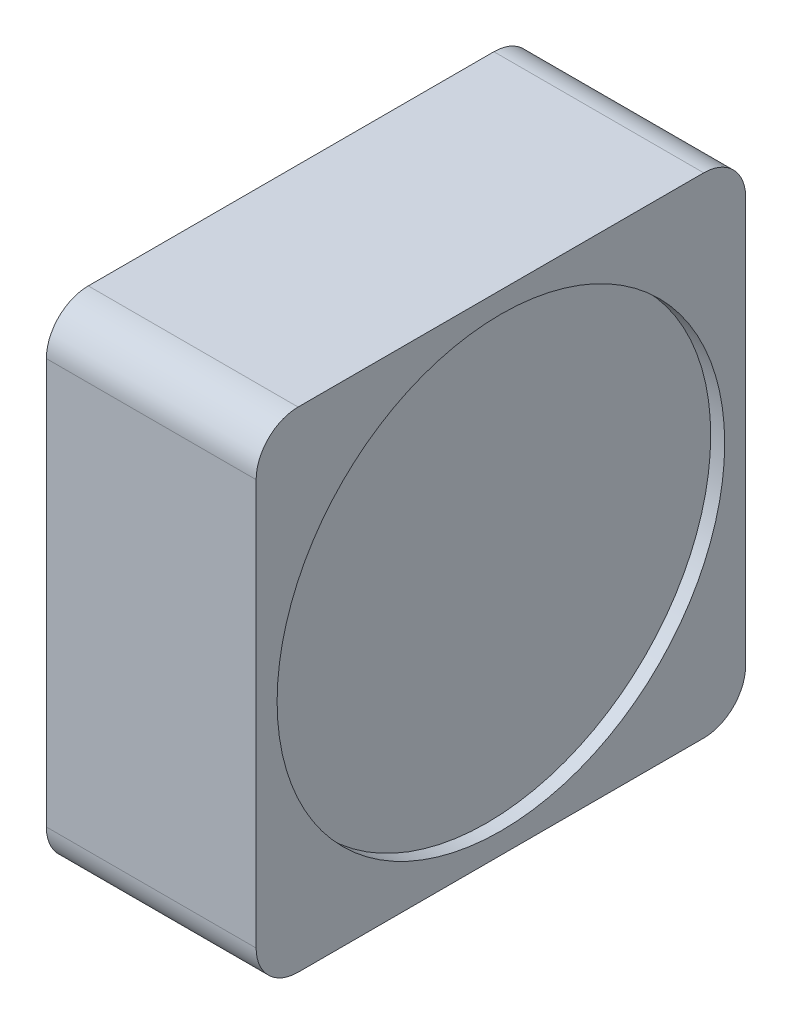
ISO-10303-21;
HEADER;
FILE_DESCRIPTION(('STEP AP214'),'2;1');
FILE_NAME('part.step','',(''),(''),'','','');
FILE_SCHEMA(('AUTOMOTIVE_DESIGN { 1 0 10303 214 1 1 1 1 }'));
ENDSEC;
DATA;
#1=APPLICATION_CONTEXT('core data for automotive mechanical design processes');
#2=APPLICATION_PROTOCOL_DEFINITION('international standard','automotive_design',2000,#1);
#3=PRODUCT_CONTEXT('',#1,'mechanical');
#4=PRODUCT('Part','Part','',(#3));
#5=PRODUCT_RELATED_PRODUCT_CATEGORY('part','',(#4));
#6=PRODUCT_DEFINITION_FORMATION('','',#4);
#7=PRODUCT_DEFINITION_CONTEXT('part definition',#1,'design');
#8=PRODUCT_DEFINITION('design','',#6,#7);
#9=PRODUCT_DEFINITION_SHAPE('','',#8);
#10=(LENGTH_UNIT() NAMED_UNIT(*) SI_UNIT(.MILLI.,.METRE.));
#11=(NAMED_UNIT(*) PLANE_ANGLE_UNIT() SI_UNIT($,.RADIAN.));
#12=(NAMED_UNIT(*) SI_UNIT($,.STERADIAN.) SOLID_ANGLE_UNIT());
#13=UNCERTAINTY_MEASURE_WITH_UNIT(LENGTH_MEASURE(1.E-05),#10,'distance_accuracy_value','');
#14=(GEOMETRIC_REPRESENTATION_CONTEXT(3) GLOBAL_UNCERTAINTY_ASSIGNED_CONTEXT((#13)) GLOBAL_UNIT_ASSIGNED_CONTEXT((#10,
#11,#12)) REPRESENTATION_CONTEXT('',''));
#15=CARTESIAN_POINT('',(0.,0.,0.));
#16=DIRECTION('',(0.,0.,1.));
#17=DIRECTION('',(1.,0.,0.));
#18=AXIS2_PLACEMENT_3D('',#15,#16,#17);
#19=CARTESIAN_POINT('',(150.,-175.,-175.));
#20=DIRECTION('',(0.,0.,1.));
#21=DIRECTION('',(1.,0.,0.));
#22=AXIS2_PLACEMENT_3D('',#19,#20,#21);
#23=PLANE('',#22);
#24=DIRECTION('',(0.,1.,0.));
#25=VECTOR('',#24,1.);
#26=CARTESIAN_POINT('',(150.,-175.,-175.));
#27=LINE('',#26,#25);
#28=CARTESIAN_POINT('',(150.,-145.,-175.));
#29=VERTEX_POINT('',#28);
#30=CARTESIAN_POINT('',(150.,145.,-175.));
#31=VERTEX_POINT('',#30);
#32=EDGE_CURVE('E120',#29,#31,#27,.T.);
#33=ORIENTED_EDGE('',*,*,#32,.F.);
#34=DIRECTION('',(-1.,0.,0.));
#35=VECTOR('',#34,1.);
#36=CARTESIAN_POINT('',(150.,-145.,-175.));
#37=LINE('',#36,#35);
#38=CARTESIAN_POINT('',(0.,-145.,-175.));
#39=VERTEX_POINT('',#38);
#40=EDGE_CURVE('E105',#29,#39,#37,.T.);
#41=ORIENTED_EDGE('',*,*,#40,.T.);
#42=DIRECTION('',(0.,1.,0.));
#43=VECTOR('',#42,1.);
#44=CARTESIAN_POINT('',(0.,-175.,-175.));
#45=LINE('',#44,#43);
#46=CARTESIAN_POINT('',(0.,145.,-175.));
#47=VERTEX_POINT('',#46);
#48=EDGE_CURVE('E117',#39,#47,#45,.T.);
#49=ORIENTED_EDGE('',*,*,#48,.T.);
#50=DIRECTION('',(-1.,0.,0.));
#51=VECTOR('',#50,1.);
#52=CARTESIAN_POINT('',(150.,145.,-175.));
#53=LINE('',#52,#51);
#54=EDGE_CURVE('E122',#47,#31,#53,.F.);
#55=ORIENTED_EDGE('',*,*,#54,.T.);
#56=EDGE_LOOP('',(#33,#41,#49,#55));
#57=FACE_BOUND('',#56,.T.);
#58=ADVANCED_FACE('F35',(#57),#23,.F.);
#59=CARTESIAN_POINT('',(150.,175.,175.));
#60=DIRECTION('',(0.,-1.,0.));
#61=DIRECTION('',(0.,0.,-1.));
#62=AXIS2_PLACEMENT_3D('',#59,#60,#61);
#63=PLANE('',#62);
#64=DIRECTION('',(0.,0.,1.));
#65=VECTOR('',#64,1.);
#66=CARTESIAN_POINT('',(0.,175.,175.));
#67=LINE('',#66,#65);
#68=CARTESIAN_POINT('',(0.,175.,-145.));
#69=VERTEX_POINT('',#68);
#70=CARTESIAN_POINT('',(0.,175.,145.));
#71=VERTEX_POINT('',#70);
#72=EDGE_CURVE('E126',#69,#71,#67,.T.);
#73=ORIENTED_EDGE('',*,*,#72,.T.);
#74=DIRECTION('',(-1.,0.,0.));
#75=VECTOR('',#74,1.);
#76=CARTESIAN_POINT('',(150.,175.,145.));
#77=LINE('',#76,#75);
#78=CARTESIAN_POINT('',(150.,175.,145.));
#79=VERTEX_POINT('',#78);
#80=EDGE_CURVE('E11',#71,#79,#77,.F.);
#81=ORIENTED_EDGE('',*,*,#80,.T.);
#82=DIRECTION('',(0.,0.,1.));
#83=VECTOR('',#82,1.);
#84=CARTESIAN_POINT('',(150.,175.,175.));
#85=LINE('',#84,#83);
#86=CARTESIAN_POINT('',(150.,175.,-145.));
#87=VERTEX_POINT('',#86);
#88=EDGE_CURVE('E166',#87,#79,#85,.T.);
#89=ORIENTED_EDGE('',*,*,#88,.F.);
#90=DIRECTION('',(-1.,0.,0.));
#91=VECTOR('',#90,1.);
#92=CARTESIAN_POINT('',(150.,175.,-145.));
#93=LINE('',#92,#91);
#94=EDGE_CURVE('E43',#87,#69,#93,.T.);
#95=ORIENTED_EDGE('',*,*,#94,.T.);
#96=EDGE_LOOP('',(#73,#81,#89,#95));
#97=FACE_BOUND('',#96,.T.);
#98=ADVANCED_FACE('F164',(#97),#63,.F.);
#99=CARTESIAN_POINT('',(150.,-175.,175.));
#100=DIRECTION('',(0.,0.,-1.));
#101=DIRECTION('',(-1.,0.,0.));
#102=AXIS2_PLACEMENT_3D('',#99,#100,#101);
#103=PLANE('',#102);
#104=DIRECTION('',(0.,-1.,0.));
#105=VECTOR('',#104,1.);
#106=CARTESIAN_POINT('',(0.,-175.,175.));
#107=LINE('',#106,#105);
#108=CARTESIAN_POINT('',(0.,145.,175.));
#109=VERTEX_POINT('',#108);
#110=CARTESIAN_POINT('',(0.,-145.,175.));
#111=VERTEX_POINT('',#110);
#112=EDGE_CURVE('E130',#109,#111,#107,.T.);
#113=ORIENTED_EDGE('',*,*,#112,.T.);
#114=DIRECTION('',(-1.,0.,0.));
#115=VECTOR('',#114,1.);
#116=CARTESIAN_POINT('',(150.,-145.,175.));
#117=LINE('',#116,#115);
#118=CARTESIAN_POINT('',(150.,-145.,175.));
#119=VERTEX_POINT('',#118);
#120=EDGE_CURVE('E50',#111,#119,#117,.F.);
#121=ORIENTED_EDGE('',*,*,#120,.T.);
#122=DIRECTION('',(0.,-1.,0.));
#123=VECTOR('',#122,1.);
#124=CARTESIAN_POINT('',(150.,-175.,175.));
#125=LINE('',#124,#123);
#126=CARTESIAN_POINT('',(150.,145.,175.));
#127=VERTEX_POINT('',#126);
#128=EDGE_CURVE('E174',#127,#119,#125,.T.);
#129=ORIENTED_EDGE('',*,*,#128,.F.);
#130=DIRECTION('',(-1.,0.,0.));
#131=VECTOR('',#130,1.);
#132=CARTESIAN_POINT('',(150.,145.,175.));
#133=LINE('',#132,#131);
#134=EDGE_CURVE('E157',#127,#109,#133,.T.);
#135=ORIENTED_EDGE('',*,*,#134,.T.);
#136=EDGE_LOOP('',(#113,#121,#129,#135));
#137=FACE_BOUND('',#136,.T.);
#138=ADVANCED_FACE('F173',(#137),#103,.F.);
#139=CARTESIAN_POINT('',(150.,-175.,175.));
#140=DIRECTION('',(0.,1.,0.));
#141=DIRECTION('',(0.,0.,1.));
#142=AXIS2_PLACEMENT_3D('',#139,#140,#141);
#143=PLANE('',#142);
#144=DIRECTION('',(0.,0.,-1.));
#145=VECTOR('',#144,1.);
#146=CARTESIAN_POINT('',(0.,-175.,175.));
#147=LINE('',#146,#145);
#148=CARTESIAN_POINT('',(0.,-175.,145.));
#149=VERTEX_POINT('',#148);
#150=CARTESIAN_POINT('',(0.,-175.,-145.));
#151=VERTEX_POINT('',#150);
#152=EDGE_CURVE('E140',#149,#151,#147,.T.);
#153=ORIENTED_EDGE('',*,*,#152,.T.);
#154=DIRECTION('',(-1.,0.,0.));
#155=VECTOR('',#154,1.);
#156=CARTESIAN_POINT('',(150.,-175.,-145.));
#157=LINE('',#156,#155);
#158=CARTESIAN_POINT('',(150.,-175.,-145.));
#159=VERTEX_POINT('',#158);
#160=EDGE_CURVE('E106',#151,#159,#157,.F.);
#161=ORIENTED_EDGE('',*,*,#160,.T.);
#162=DIRECTION('',(0.,0.,-1.));
#163=VECTOR('',#162,1.);
#164=CARTESIAN_POINT('',(150.,-175.,175.));
#165=LINE('',#164,#163);
#166=CARTESIAN_POINT('',(150.,-175.,145.));
#167=VERTEX_POINT('',#166);
#168=EDGE_CURVE('E136',#167,#159,#165,.T.);
#169=ORIENTED_EDGE('',*,*,#168,.F.);
#170=DIRECTION('',(-1.,0.,0.));
#171=VECTOR('',#170,1.);
#172=CARTESIAN_POINT('',(150.,-175.,145.));
#173=LINE('',#172,#171);
#174=EDGE_CURVE('E111',#167,#149,#173,.T.);
#175=ORIENTED_EDGE('',*,*,#174,.T.);
#176=EDGE_LOOP('',(#153,#161,#169,#175));
#177=FACE_BOUND('',#176,.T.);
#178=ADVANCED_FACE('F187',(#177),#143,.F.);
#179=CARTESIAN_POINT('',(150.,0.,0.));
#180=DIRECTION('',(-1.,0.,0.));
#181=DIRECTION('',(0.,0.,1.));
#182=AXIS2_PLACEMENT_3D('',#179,#180,#181);
#183=PLANE('',#182);
#184=CARTESIAN_POINT('',(150.,0.,0.));
#185=DIRECTION('',(1.,0.,0.));
#186=DIRECTION('',(0.,0.,-1.));
#187=AXIS2_PLACEMENT_3D('',#184,#185,#186);
#188=CIRCLE('',#187,160.);
#189=CARTESIAN_POINT('',(150.,0.,-160.));
#190=VERTEX_POINT('',#189);
#191=EDGE_CURVE('E133',#190,#190,#188,.T.);
#192=ORIENTED_EDGE('',*,*,#191,.F.);
#193=EDGE_LOOP('',(#192));
#194=FACE_BOUND('',#193,.T.);
#195=ORIENTED_EDGE('',*,*,#168,.T.);
#196=CARTESIAN_POINT('',(150.,-145.,-145.));
#197=DIRECTION('',(-1.,0.,0.));
#198=DIRECTION('',(0.,0.,1.));
#199=AXIS2_PLACEMENT_3D('',#196,#197,#198);
#200=CIRCLE('',#199,30.);
#201=EDGE_CURVE('E155',#159,#29,#200,.F.);
#202=ORIENTED_EDGE('',*,*,#201,.T.);
#203=ORIENTED_EDGE('',*,*,#32,.T.);
#204=CARTESIAN_POINT('',(150.,145.,-145.));
#205=DIRECTION('',(-1.,0.,0.));
#206=DIRECTION('',(0.,0.,1.));
#207=AXIS2_PLACEMENT_3D('',#204,#205,#206);
#208=CIRCLE('',#207,30.);
#209=EDGE_CURVE('E150',#31,#87,#208,.F.);
#210=ORIENTED_EDGE('',*,*,#209,.T.);
#211=ORIENTED_EDGE('',*,*,#88,.T.);
#212=CARTESIAN_POINT('',(150.,145.,145.));
#213=DIRECTION('',(-1.,0.,0.));
#214=DIRECTION('',(0.,0.,1.));
#215=AXIS2_PLACEMENT_3D('',#212,#213,#214);
#216=CIRCLE('',#215,30.);
#217=EDGE_CURVE('E57',#79,#127,#216,.F.);
#218=ORIENTED_EDGE('',*,*,#217,.T.);
#219=ORIENTED_EDGE('',*,*,#128,.T.);
#220=CARTESIAN_POINT('',(150.,-145.,145.));
#221=DIRECTION('',(-1.,0.,0.));
#222=DIRECTION('',(0.,0.,1.));
#223=AXIS2_PLACEMENT_3D('',#220,#221,#222);
#224=CIRCLE('',#223,30.);
#225=EDGE_CURVE('E153',#119,#167,#224,.F.);
#226=ORIENTED_EDGE('',*,*,#225,.T.);
#227=EDGE_LOOP('',(#195,#202,#203,#210,#211,#218,#219,#226));
#228=FACE_BOUND('',#227,.T.);
#229=ADVANCED_FACE('F185',(#194,#228),#183,.F.);
#230=CARTESIAN_POINT('',(0.,0.,0.));
#231=DIRECTION('',(-1.,0.,0.));
#232=DIRECTION('',(0.,0.,1.));
#233=AXIS2_PLACEMENT_3D('',#230,#231,#232);
#234=PLANE('',#233);
#235=ORIENTED_EDGE('',*,*,#48,.F.);
#236=CARTESIAN_POINT('',(0.,-145.,-145.));
#237=DIRECTION('',(-1.,0.,0.));
#238=DIRECTION('',(0.,0.,1.));
#239=AXIS2_PLACEMENT_3D('',#236,#237,#238);
#240=CIRCLE('',#239,30.);
#241=EDGE_CURVE('E101',#39,#151,#240,.T.);
#242=ORIENTED_EDGE('',*,*,#241,.T.);
#243=ORIENTED_EDGE('',*,*,#152,.F.);
#244=CARTESIAN_POINT('',(0.,-145.,145.));
#245=DIRECTION('',(-1.,0.,0.));
#246=DIRECTION('',(0.,0.,1.));
#247=AXIS2_PLACEMENT_3D('',#244,#245,#246);
#248=CIRCLE('',#247,30.);
#249=EDGE_CURVE('E112',#149,#111,#248,.T.);
#250=ORIENTED_EDGE('',*,*,#249,.T.);
#251=ORIENTED_EDGE('',*,*,#112,.F.);
#252=CARTESIAN_POINT('',(0.,145.,145.));
#253=DIRECTION('',(-1.,0.,0.));
#254=DIRECTION('',(0.,0.,1.));
#255=AXIS2_PLACEMENT_3D('',#252,#253,#254);
#256=CIRCLE('',#255,30.);
#257=EDGE_CURVE('E144',#109,#71,#256,.T.);
#258=ORIENTED_EDGE('',*,*,#257,.T.);
#259=ORIENTED_EDGE('',*,*,#72,.F.);
#260=CARTESIAN_POINT('',(0.,145.,-145.));
#261=DIRECTION('',(-1.,0.,0.));
#262=DIRECTION('',(0.,0.,1.));
#263=AXIS2_PLACEMENT_3D('',#260,#261,#262);
#264=CIRCLE('',#263,30.);
#265=EDGE_CURVE('E121',#69,#47,#264,.T.);
#266=ORIENTED_EDGE('',*,*,#265,.T.);
#267=EDGE_LOOP('',(#235,#242,#243,#250,#251,#258,#259,#266));
#268=FACE_BOUND('',#267,.T.);
#269=ADVANCED_FACE('F124',(#268),#234,.T.);
#270=CARTESIAN_POINT('',(140.,0.,0.));
#271=DIRECTION('',(1.,0.,0.));
#272=DIRECTION('',(0.,0.,-1.));
#273=AXIS2_PLACEMENT_3D('',#270,#271,#272);
#274=CYLINDRICAL_SURFACE('',#273,160.);
#275=CARTESIAN_POINT('',(140.,0.,0.));
#276=DIRECTION('',(1.,0.,0.));
#277=DIRECTION('',(0.,0.,-1.));
#278=AXIS2_PLACEMENT_3D('',#275,#276,#277);
#279=CIRCLE('',#278,160.);
#280=CARTESIAN_POINT('',(140.,0.,-160.));
#281=VERTEX_POINT('',#280);
#282=EDGE_CURVE('E127',#281,#281,#279,.T.);
#283=ORIENTED_EDGE('',*,*,#282,.F.);
#284=EDGE_LOOP('',(#283));
#285=FACE_BOUND('',#284,.T.);
#286=ORIENTED_EDGE('',*,*,#191,.T.);
#287=EDGE_LOOP('',(#286));
#288=FACE_BOUND('',#287,.T.);
#289=ADVANCED_FACE('F183',(#285,#288),#274,.F.);
#290=CARTESIAN_POINT('',(140.,0.,0.));
#291=DIRECTION('',(1.,0.,0.));
#292=DIRECTION('',(0.,0.,-1.));
#293=AXIS2_PLACEMENT_3D('',#290,#291,#292);
#294=PLANE('',#293);
#295=ORIENTED_EDGE('',*,*,#282,.T.);
#296=EDGE_LOOP('',(#295));
#297=FACE_BOUND('',#296,.T.);
#298=ADVANCED_FACE('F200',(#297),#294,.T.);
#299=CARTESIAN_POINT('',(150.,-145.,-145.));
#300=DIRECTION('',(-1.,0.,0.));
#301=DIRECTION('',(0.,0.,1.));
#302=AXIS2_PLACEMENT_3D('',#299,#300,#301);
#303=CYLINDRICAL_SURFACE('',#302,30.);
#304=ORIENTED_EDGE('',*,*,#201,.F.);
#305=ORIENTED_EDGE('',*,*,#160,.F.);
#306=ORIENTED_EDGE('',*,*,#241,.F.);
#307=ORIENTED_EDGE('',*,*,#40,.F.);
#308=EDGE_LOOP('',(#304,#305,#306,#307));
#309=FACE_BOUND('',#308,.T.);
#310=ADVANCED_FACE('F104',(#309),#303,.T.);
#311=CARTESIAN_POINT('',(150.,-145.,145.));
#312=DIRECTION('',(-1.,0.,0.));
#313=DIRECTION('',(0.,0.,1.));
#314=AXIS2_PLACEMENT_3D('',#311,#312,#313);
#315=CYLINDRICAL_SURFACE('',#314,30.);
#316=ORIENTED_EDGE('',*,*,#225,.F.);
#317=ORIENTED_EDGE('',*,*,#120,.F.);
#318=ORIENTED_EDGE('',*,*,#249,.F.);
#319=ORIENTED_EDGE('',*,*,#174,.F.);
#320=EDGE_LOOP('',(#316,#317,#318,#319));
#321=FACE_BOUND('',#320,.T.);
#322=ADVANCED_FACE('F193',(#321),#315,.T.);
#323=CARTESIAN_POINT('',(150.,145.,145.));
#324=DIRECTION('',(-1.,0.,0.));
#325=DIRECTION('',(0.,0.,1.));
#326=AXIS2_PLACEMENT_3D('',#323,#324,#325);
#327=CYLINDRICAL_SURFACE('',#326,30.);
#328=ORIENTED_EDGE('',*,*,#217,.F.);
#329=ORIENTED_EDGE('',*,*,#80,.F.);
#330=ORIENTED_EDGE('',*,*,#257,.F.);
#331=ORIENTED_EDGE('',*,*,#134,.F.);
#332=EDGE_LOOP('',(#328,#329,#330,#331));
#333=FACE_BOUND('',#332,.T.);
#334=ADVANCED_FACE('F172',(#333),#327,.T.);
#335=CARTESIAN_POINT('',(150.,145.,-145.));
#336=DIRECTION('',(-1.,0.,0.));
#337=DIRECTION('',(0.,0.,1.));
#338=AXIS2_PLACEMENT_3D('',#335,#336,#337);
#339=CYLINDRICAL_SURFACE('',#338,30.);
#340=ORIENTED_EDGE('',*,*,#209,.F.);
#341=ORIENTED_EDGE('',*,*,#54,.F.);
#342=ORIENTED_EDGE('',*,*,#265,.F.);
#343=ORIENTED_EDGE('',*,*,#94,.F.);
#344=EDGE_LOOP('',(#340,#341,#342,#343));
#345=FACE_BOUND('',#344,.T.);
#346=ADVANCED_FACE('F37',(#345),#339,.T.);
#347=CLOSED_SHELL('',(#58,#98,#138,#178,#229,#269,#289,#298,#310,#322,#334,#346));
#348=MANIFOLD_SOLID_BREP('B2',#347);
#349=ADVANCED_BREP_SHAPE_REPRESENTATION('',(#18,#348),#14);
#350=SHAPE_DEFINITION_REPRESENTATION(#9,#349);
ENDSEC;
END-ISO-10303-21;
